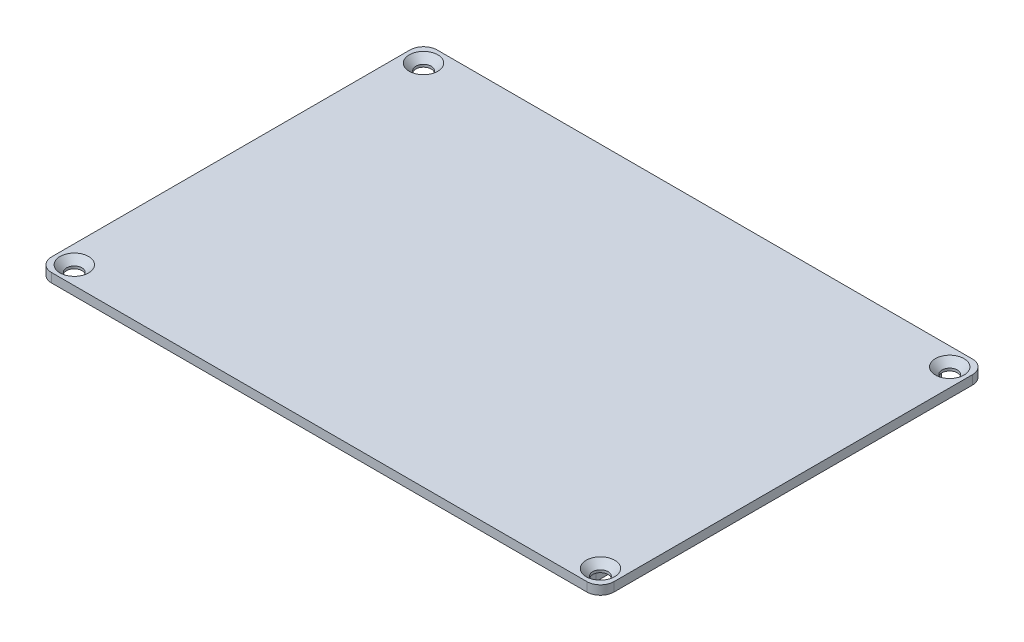
ISO-10303-21;
HEADER;
FILE_DESCRIPTION(('STEP AP214'),'2;1');
FILE_NAME('part.step','',(''),(''),'','','');
FILE_SCHEMA(('AUTOMOTIVE_DESIGN { 1 0 10303 214 1 1 1 1 }'));
ENDSEC;
DATA;
#1=APPLICATION_CONTEXT('core data for automotive mechanical design processes');
#2=APPLICATION_PROTOCOL_DEFINITION('international standard','automotive_design',2000,#1);
#3=PRODUCT_CONTEXT('',#1,'mechanical');
#4=PRODUCT('Part','Part','',(#3));
#5=PRODUCT_RELATED_PRODUCT_CATEGORY('part','',(#4));
#6=PRODUCT_DEFINITION_FORMATION('','',#4);
#7=PRODUCT_DEFINITION_CONTEXT('part definition',#1,'design');
#8=PRODUCT_DEFINITION('design','',#6,#7);
#9=PRODUCT_DEFINITION_SHAPE('','',#8);
#10=(LENGTH_UNIT() NAMED_UNIT(*) SI_UNIT(.MILLI.,.METRE.));
#11=(NAMED_UNIT(*) PLANE_ANGLE_UNIT() SI_UNIT($,.RADIAN.));
#12=(NAMED_UNIT(*) SI_UNIT($,.STERADIAN.) SOLID_ANGLE_UNIT());
#13=UNCERTAINTY_MEASURE_WITH_UNIT(LENGTH_MEASURE(1.E-05),#10,'distance_accuracy_value','');
#14=(GEOMETRIC_REPRESENTATION_CONTEXT(3) GLOBAL_UNCERTAINTY_ASSIGNED_CONTEXT((#13)) GLOBAL_UNIT_ASSIGNED_CONTEXT((#10,
#11,#12)) REPRESENTATION_CONTEXT('',''));
#15=CARTESIAN_POINT('',(0.,0.,0.));
#16=DIRECTION('',(0.,0.,1.));
#17=DIRECTION('',(1.,0.,0.));
#18=AXIS2_PLACEMENT_3D('',#15,#16,#17);
#19=CARTESIAN_POINT('',(0.,0.,0.));
#20=DIRECTION('',(0.,-1.,0.));
#21=DIRECTION('',(0.,0.,-1.));
#22=AXIS2_PLACEMENT_3D('',#19,#20,#21);
#23=PLANE('',#22);
#24=DIRECTION('',(0.,0.,-1.));
#25=VECTOR('',#24,1.);
#26=CARTESIAN_POINT('',(112.,0.,0.));
#27=LINE('',#26,#25);
#28=CARTESIAN_POINT('',(112.,0.,-3.));
#29=VERTEX_POINT('',#28);
#30=CARTESIAN_POINT('',(112.,0.,-78.));
#31=VERTEX_POINT('',#30);
#32=EDGE_CURVE('E222',#29,#31,#27,.T.);
#33=ORIENTED_EDGE('',*,*,#32,.F.);
#34=CARTESIAN_POINT('',(109.,0.,-3.));
#35=DIRECTION('',(0.,-1.,0.));
#36=DIRECTION('',(0.,0.,-1.));
#37=AXIS2_PLACEMENT_3D('',#34,#35,#36);
#38=CIRCLE('',#37,3.);
#39=CARTESIAN_POINT('',(109.,0.,0.));
#40=VERTEX_POINT('',#39);
#41=EDGE_CURVE('E237',#29,#40,#38,.T.);
#42=ORIENTED_EDGE('',*,*,#41,.T.);
#43=DIRECTION('',(1.,0.,0.));
#44=VECTOR('',#43,1.);
#45=CARTESIAN_POINT('',(0.,0.,0.));
#46=LINE('',#45,#44);
#47=CARTESIAN_POINT('',(3.,0.,0.));
#48=VERTEX_POINT('',#47);
#49=EDGE_CURVE('E200',#48,#40,#46,.T.);
#50=ORIENTED_EDGE('',*,*,#49,.F.);
#51=CARTESIAN_POINT('',(3.,0.,-3.));
#52=DIRECTION('',(0.,-1.,0.));
#53=DIRECTION('',(0.,0.,-1.));
#54=AXIS2_PLACEMENT_3D('',#51,#52,#53);
#55=CIRCLE('',#54,3.);
#56=CARTESIAN_POINT('',(0.,0.,-3.));
#57=VERTEX_POINT('',#56);
#58=EDGE_CURVE('E235',#48,#57,#55,.T.);
#59=ORIENTED_EDGE('',*,*,#58,.T.);
#60=DIRECTION('',(0.,0.,1.));
#61=VECTOR('',#60,1.);
#62=CARTESIAN_POINT('',(0.,0.,0.));
#63=LINE('',#62,#61);
#64=CARTESIAN_POINT('',(0.,0.,-78.));
#65=VERTEX_POINT('',#64);
#66=EDGE_CURVE('E196',#65,#57,#63,.T.);
#67=ORIENTED_EDGE('',*,*,#66,.F.);
#68=CARTESIAN_POINT('',(3.,0.,-78.));
#69=DIRECTION('',(0.,-1.,0.));
#70=DIRECTION('',(0.,0.,-1.));
#71=AXIS2_PLACEMENT_3D('',#68,#69,#70);
#72=CIRCLE('',#71,3.);
#73=CARTESIAN_POINT('',(3.,0.,-81.));
#74=VERTEX_POINT('',#73);
#75=EDGE_CURVE('E233',#65,#74,#72,.T.);
#76=ORIENTED_EDGE('',*,*,#75,.T.);
#77=DIRECTION('',(-1.,0.,0.));
#78=VECTOR('',#77,1.);
#79=CARTESIAN_POINT('',(0.,0.,-81.));
#80=LINE('',#79,#78);
#81=CARTESIAN_POINT('',(109.,0.,-81.));
#82=VERTEX_POINT('',#81);
#83=EDGE_CURVE('E210',#82,#74,#80,.T.);
#84=ORIENTED_EDGE('',*,*,#83,.F.);
#85=CARTESIAN_POINT('',(109.,0.,-78.));
#86=DIRECTION('',(0.,-1.,0.));
#87=DIRECTION('',(0.,0.,-1.));
#88=AXIS2_PLACEMENT_3D('',#85,#86,#87);
#89=CIRCLE('',#88,3.);
#90=EDGE_CURVE('E231',#82,#31,#89,.T.);
#91=ORIENTED_EDGE('',*,*,#90,.T.);
#92=EDGE_LOOP('',(#33,#42,#50,#59,#67,#76,#84,#91));
#93=FACE_BOUND('',#92,.T.);
#94=DIRECTION('',(-1.,0.,0.));
#95=VECTOR('',#94,1.);
#96=CARTESIAN_POINT('',(2.,0.,-79.));
#97=LINE('',#96,#95);
#98=CARTESIAN_POINT('',(110.,0.,-79.));
#99=VERTEX_POINT('',#98);
#100=CARTESIAN_POINT('',(2.,0.,-79.));
#101=VERTEX_POINT('',#100);
#102=EDGE_CURVE('E191',#99,#101,#97,.T.);
#103=ORIENTED_EDGE('',*,*,#102,.T.);
#104=DIRECTION('',(0.,0.,1.));
#105=VECTOR('',#104,1.);
#106=CARTESIAN_POINT('',(2.,0.,-2.));
#107=LINE('',#106,#105);
#108=CARTESIAN_POINT('',(2.,0.,-2.));
#109=VERTEX_POINT('',#108);
#110=EDGE_CURVE('E336',#101,#109,#107,.T.);
#111=ORIENTED_EDGE('',*,*,#110,.T.);
#112=DIRECTION('',(1.,0.,0.));
#113=VECTOR('',#112,1.);
#114=CARTESIAN_POINT('',(2.,0.,-2.));
#115=LINE('',#114,#113);
#116=CARTESIAN_POINT('',(110.,0.,-2.));
#117=VERTEX_POINT('',#116);
#118=EDGE_CURVE('E195',#109,#117,#115,.T.);
#119=ORIENTED_EDGE('',*,*,#118,.T.);
#120=DIRECTION('',(0.,0.,-1.));
#121=VECTOR('',#120,1.);
#122=CARTESIAN_POINT('',(110.,0.,-2.));
#123=LINE('',#122,#121);
#124=EDGE_CURVE('E351',#117,#99,#123,.T.);
#125=ORIENTED_EDGE('',*,*,#124,.T.);
#126=EDGE_LOOP('',(#103,#111,#119,#125));
#127=FACE_BOUND('',#126,.T.);
#128=ADVANCED_FACE('F33',(#93,#127),#23,.T.);
#129=CARTESIAN_POINT('',(0.,2.,0.));
#130=DIRECTION('',(1.,0.,0.));
#131=DIRECTION('',(0.,0.,-1.));
#132=AXIS2_PLACEMENT_3D('',#129,#130,#131);
#133=PLANE('',#132);
#134=ORIENTED_EDGE('',*,*,#66,.T.);
#135=DIRECTION('',(0.,-1.,0.));
#136=VECTOR('',#135,1.);
#137=CARTESIAN_POINT('',(0.,2.,-3.));
#138=LINE('',#137,#136);
#139=CARTESIAN_POINT('',(0.,2.,-3.));
#140=VERTEX_POINT('',#139);
#141=EDGE_CURVE('E281',#57,#140,#138,.F.);
#142=ORIENTED_EDGE('',*,*,#141,.T.);
#143=DIRECTION('',(0.,0.,1.));
#144=VECTOR('',#143,1.);
#145=CARTESIAN_POINT('',(0.,2.,0.));
#146=LINE('',#145,#144);
#147=CARTESIAN_POINT('',(0.,2.,-78.));
#148=VERTEX_POINT('',#147);
#149=EDGE_CURVE('E206',#148,#140,#146,.T.);
#150=ORIENTED_EDGE('',*,*,#149,.F.);
#151=DIRECTION('',(0.,-1.,0.));
#152=VECTOR('',#151,1.);
#153=CARTESIAN_POINT('',(0.,2.,-78.));
#154=LINE('',#153,#152);
#155=EDGE_CURVE('E278',#148,#65,#154,.T.);
#156=ORIENTED_EDGE('',*,*,#155,.T.);
#157=EDGE_LOOP('',(#134,#142,#150,#156));
#158=FACE_BOUND('',#157,.T.);
#159=ADVANCED_FACE('F365',(#158),#133,.F.);
#160=CARTESIAN_POINT('',(0.,2.,0.));
#161=DIRECTION('',(0.,0.,-1.));
#162=DIRECTION('',(-1.,0.,0.));
#163=AXIS2_PLACEMENT_3D('',#160,#161,#162);
#164=PLANE('',#163);
#165=ORIENTED_EDGE('',*,*,#49,.T.);
#166=DIRECTION('',(0.,-1.,0.));
#167=VECTOR('',#166,1.);
#168=CARTESIAN_POINT('',(109.,2.,0.));
#169=LINE('',#168,#167);
#170=CARTESIAN_POINT('',(109.,2.,0.));
#171=VERTEX_POINT('',#170);
#172=EDGE_CURVE('E242',#40,#171,#169,.F.);
#173=ORIENTED_EDGE('',*,*,#172,.T.);
#174=DIRECTION('',(1.,0.,0.));
#175=VECTOR('',#174,1.);
#176=CARTESIAN_POINT('',(0.,2.,0.));
#177=LINE('',#176,#175);
#178=CARTESIAN_POINT('',(3.,2.,0.));
#179=VERTEX_POINT('',#178);
#180=EDGE_CURVE('E209',#179,#171,#177,.T.);
#181=ORIENTED_EDGE('',*,*,#180,.F.);
#182=DIRECTION('',(0.,-1.,0.));
#183=VECTOR('',#182,1.);
#184=CARTESIAN_POINT('',(3.,2.,0.));
#185=LINE('',#184,#183);
#186=EDGE_CURVE('E239',#179,#48,#185,.T.);
#187=ORIENTED_EDGE('',*,*,#186,.T.);
#188=EDGE_LOOP('',(#165,#173,#181,#187));
#189=FACE_BOUND('',#188,.T.);
#190=ADVANCED_FACE('F371',(#189),#164,.F.);
#191=CARTESIAN_POINT('',(112.,2.,0.));
#192=DIRECTION('',(-1.,0.,0.));
#193=DIRECTION('',(0.,0.,1.));
#194=AXIS2_PLACEMENT_3D('',#191,#192,#193);
#195=PLANE('',#194);
#196=DIRECTION('',(0.,0.,-1.));
#197=VECTOR('',#196,1.);
#198=CARTESIAN_POINT('',(112.,2.,0.));
#199=LINE('',#198,#197);
#200=CARTESIAN_POINT('',(112.,2.,-3.));
#201=VERTEX_POINT('',#200);
#202=CARTESIAN_POINT('',(112.,2.,-78.));
#203=VERTEX_POINT('',#202);
#204=EDGE_CURVE('E213',#201,#203,#199,.T.);
#205=ORIENTED_EDGE('',*,*,#204,.F.);
#206=DIRECTION('',(0.,-1.,0.));
#207=VECTOR('',#206,1.);
#208=CARTESIAN_POINT('',(112.,2.,-3.));
#209=LINE('',#208,#207);
#210=EDGE_CURVE('E228',#201,#29,#209,.T.);
#211=ORIENTED_EDGE('',*,*,#210,.T.);
#212=ORIENTED_EDGE('',*,*,#32,.T.);
#213=DIRECTION('',(0.,-1.,0.));
#214=VECTOR('',#213,1.);
#215=CARTESIAN_POINT('',(112.,2.,-78.));
#216=LINE('',#215,#214);
#217=EDGE_CURVE('E218',#31,#203,#216,.F.);
#218=ORIENTED_EDGE('',*,*,#217,.T.);
#219=EDGE_LOOP('',(#205,#211,#212,#218));
#220=FACE_BOUND('',#219,.T.);
#221=ADVANCED_FACE('F381',(#220),#195,.F.);
#222=CARTESIAN_POINT('',(0.,2.,-81.));
#223=DIRECTION('',(0.,0.,1.));
#224=DIRECTION('',(1.,0.,0.));
#225=AXIS2_PLACEMENT_3D('',#222,#223,#224);
#226=PLANE('',#225);
#227=ORIENTED_EDGE('',*,*,#83,.T.);
#228=DIRECTION('',(0.,-1.,0.));
#229=VECTOR('',#228,1.);
#230=CARTESIAN_POINT('',(3.,2.,-81.));
#231=LINE('',#230,#229);
#232=CARTESIAN_POINT('',(3.,2.,-81.));
#233=VERTEX_POINT('',#232);
#234=EDGE_CURVE('E286',#74,#233,#231,.F.);
#235=ORIENTED_EDGE('',*,*,#234,.T.);
#236=DIRECTION('',(-1.,0.,0.));
#237=VECTOR('',#236,1.);
#238=CARTESIAN_POINT('',(0.,2.,-81.));
#239=LINE('',#238,#237);
#240=CARTESIAN_POINT('',(109.,2.,-81.));
#241=VERTEX_POINT('',#240);
#242=EDGE_CURVE('E216',#241,#233,#239,.T.);
#243=ORIENTED_EDGE('',*,*,#242,.F.);
#244=DIRECTION('',(0.,-1.,0.));
#245=VECTOR('',#244,1.);
#246=CARTESIAN_POINT('',(109.,2.,-81.));
#247=LINE('',#246,#245);
#248=EDGE_CURVE('E283',#241,#82,#247,.T.);
#249=ORIENTED_EDGE('',*,*,#248,.T.);
#250=EDGE_LOOP('',(#227,#235,#243,#249));
#251=FACE_BOUND('',#250,.T.);
#252=ADVANCED_FACE('F378',(#251),#226,.F.);
#253=CARTESIAN_POINT('',(2.,2.,-2.));
#254=DIRECTION('',(1.,0.,0.));
#255=DIRECTION('',(0.,0.,-1.));
#256=AXIS2_PLACEMENT_3D('',#253,#254,#255);
#257=PLANE('',#256);
#258=ORIENTED_EDGE('',*,*,#110,.F.);
#259=DIRECTION('',(0.,-1.,0.));
#260=VECTOR('',#259,1.);
#261=CARTESIAN_POINT('',(2.,2.,-79.));
#262=LINE('',#261,#260);
#263=CARTESIAN_POINT('',(2.,2.,-79.));
#264=VERTEX_POINT('',#263);
#265=EDGE_CURVE('E190',#264,#101,#262,.T.);
#266=ORIENTED_EDGE('',*,*,#265,.F.);
#267=DIRECTION('',(0.,0.,1.));
#268=VECTOR('',#267,1.);
#269=CARTESIAN_POINT('',(2.,2.,-2.));
#270=LINE('',#269,#268);
#271=CARTESIAN_POINT('',(2.,2.,-2.));
#272=VERTEX_POINT('',#271);
#273=EDGE_CURVE('E175',#264,#272,#270,.T.);
#274=ORIENTED_EDGE('',*,*,#273,.T.);
#275=DIRECTION('',(0.,-1.,0.));
#276=VECTOR('',#275,1.);
#277=CARTESIAN_POINT('',(2.,2.,-2.));
#278=LINE('',#277,#276);
#279=EDGE_CURVE('E187',#272,#109,#278,.T.);
#280=ORIENTED_EDGE('',*,*,#279,.T.);
#281=EDGE_LOOP('',(#258,#266,#274,#280));
#282=FACE_BOUND('',#281,.T.);
#283=ADVANCED_FACE('F186',(#282),#257,.T.);
#284=CARTESIAN_POINT('',(2.,2.,-2.));
#285=DIRECTION('',(0.,0.,-1.));
#286=DIRECTION('',(-1.,0.,0.));
#287=AXIS2_PLACEMENT_3D('',#284,#285,#286);
#288=PLANE('',#287);
#289=ORIENTED_EDGE('',*,*,#118,.F.);
#290=ORIENTED_EDGE('',*,*,#279,.F.);
#291=DIRECTION('',(1.,0.,0.));
#292=VECTOR('',#291,1.);
#293=CARTESIAN_POINT('',(2.,2.,-2.));
#294=LINE('',#293,#292);
#295=CARTESIAN_POINT('',(110.,2.,-2.));
#296=VERTEX_POINT('',#295);
#297=EDGE_CURVE('E172',#272,#296,#294,.T.);
#298=ORIENTED_EDGE('',*,*,#297,.T.);
#299=DIRECTION('',(0.,-1.,0.));
#300=VECTOR('',#299,1.);
#301=CARTESIAN_POINT('',(110.,2.,-2.));
#302=LINE('',#301,#300);
#303=EDGE_CURVE('E197',#296,#117,#302,.T.);
#304=ORIENTED_EDGE('',*,*,#303,.T.);
#305=EDGE_LOOP('',(#289,#290,#298,#304));
#306=FACE_BOUND('',#305,.T.);
#307=ADVANCED_FACE('F193',(#306),#288,.T.);
#308=CARTESIAN_POINT('',(110.,2.,-2.));
#309=DIRECTION('',(-1.,0.,0.));
#310=DIRECTION('',(0.,0.,1.));
#311=AXIS2_PLACEMENT_3D('',#308,#309,#310);
#312=PLANE('',#311);
#313=ORIENTED_EDGE('',*,*,#124,.F.);
#314=ORIENTED_EDGE('',*,*,#303,.F.);
#315=DIRECTION('',(0.,0.,-1.));
#316=VECTOR('',#315,1.);
#317=CARTESIAN_POINT('',(110.,2.,-2.));
#318=LINE('',#317,#316);
#319=CARTESIAN_POINT('',(110.,2.,-79.));
#320=VERTEX_POINT('',#319);
#321=EDGE_CURVE('E178',#296,#320,#318,.T.);
#322=ORIENTED_EDGE('',*,*,#321,.T.);
#323=DIRECTION('',(0.,-1.,0.));
#324=VECTOR('',#323,1.);
#325=CARTESIAN_POINT('',(110.,2.,-79.));
#326=LINE('',#325,#324);
#327=EDGE_CURVE('E202',#320,#99,#326,.T.);
#328=ORIENTED_EDGE('',*,*,#327,.T.);
#329=EDGE_LOOP('',(#313,#314,#322,#328));
#330=FACE_BOUND('',#329,.T.);
#331=ADVANCED_FACE('F360',(#330),#312,.T.);
#332=CARTESIAN_POINT('',(2.,2.,-79.));
#333=DIRECTION('',(0.,0.,1.));
#334=DIRECTION('',(1.,0.,0.));
#335=AXIS2_PLACEMENT_3D('',#332,#333,#334);
#336=PLANE('',#335);
#337=ORIENTED_EDGE('',*,*,#102,.F.);
#338=ORIENTED_EDGE('',*,*,#327,.F.);
#339=DIRECTION('',(-1.,0.,0.));
#340=VECTOR('',#339,1.);
#341=CARTESIAN_POINT('',(2.,2.,-79.));
#342=LINE('',#341,#340);
#343=EDGE_CURVE('E347',#320,#264,#342,.T.);
#344=ORIENTED_EDGE('',*,*,#343,.T.);
#345=ORIENTED_EDGE('',*,*,#265,.T.);
#346=EDGE_LOOP('',(#337,#338,#344,#345));
#347=FACE_BOUND('',#346,.T.);
#348=ADVANCED_FACE('F362',(#347),#336,.T.);
#349=CARTESIAN_POINT('',(0.,2.,0.));
#350=DIRECTION('',(0.,-1.,0.));
#351=DIRECTION('',(0.,0.,-1.));
#352=AXIS2_PLACEMENT_3D('',#349,#350,#351);
#353=PLANE('',#352);
#354=ORIENTED_EDGE('',*,*,#273,.F.);
#355=ORIENTED_EDGE('',*,*,#343,.F.);
#356=ORIENTED_EDGE('',*,*,#321,.F.);
#357=ORIENTED_EDGE('',*,*,#297,.F.);
#358=EDGE_LOOP('',(#354,#355,#356,#357));
#359=FACE_BOUND('',#358,.T.);
#360=ADVANCED_FACE('F174',(#359),#353,.T.);
#361=CARTESIAN_POINT('',(-6.,4.,2.));
#362=DIRECTION('',(1.,0.,0.));
#363=DIRECTION('',(0.,0.,-1.));
#364=AXIS2_PLACEMENT_3D('',#361,#362,#363);
#365=PLANE('',#364);
#366=DIRECTION('',(0.,0.,1.));
#367=VECTOR('',#366,1.);
#368=CARTESIAN_POINT('',(-6.,4.,2.));
#369=LINE('',#368,#367);
#370=CARTESIAN_POINT('',(-6.,4.,-80.));
#371=VERTEX_POINT('',#370);
#372=CARTESIAN_POINT('',(-6.,4.,-1.));
#373=VERTEX_POINT('',#372);
#374=EDGE_CURVE('E325',#371,#373,#369,.T.);
#375=ORIENTED_EDGE('',*,*,#374,.F.);
#376=DIRECTION('',(0.,-1.,0.));
#377=VECTOR('',#376,1.);
#378=CARTESIAN_POINT('',(-6.,4.,-80.));
#379=LINE('',#378,#377);
#380=CARTESIAN_POINT('',(-6.,2.,-80.));
#381=VERTEX_POINT('',#380);
#382=EDGE_CURVE('E275',#371,#381,#379,.T.);
#383=ORIENTED_EDGE('',*,*,#382,.T.);
#384=DIRECTION('',(0.,0.,1.));
#385=VECTOR('',#384,1.);
#386=CARTESIAN_POINT('',(-6.,2.,2.));
#387=LINE('',#386,#385);
#388=CARTESIAN_POINT('',(-6.,2.,-1.));
#389=VERTEX_POINT('',#388);
#390=EDGE_CURVE('E296',#381,#389,#387,.T.);
#391=ORIENTED_EDGE('',*,*,#390,.T.);
#392=DIRECTION('',(0.,-1.,0.));
#393=VECTOR('',#392,1.);
#394=CARTESIAN_POINT('',(-6.,4.,-1.));
#395=LINE('',#394,#393);
#396=EDGE_CURVE('E273',#389,#373,#395,.F.);
#397=ORIENTED_EDGE('',*,*,#396,.T.);
#398=EDGE_LOOP('',(#375,#383,#391,#397));
#399=FACE_BOUND('',#398,.T.);
#400=ADVANCED_FACE('F461',(#399),#365,.F.);
#401=CARTESIAN_POINT('',(-6.,4.,2.));
#402=DIRECTION('',(0.,0.,-1.));
#403=DIRECTION('',(-1.,0.,0.));
#404=AXIS2_PLACEMENT_3D('',#401,#402,#403);
#405=PLANE('',#404);
#406=DIRECTION('',(1.,0.,0.));
#407=VECTOR('',#406,1.);
#408=CARTESIAN_POINT('',(-6.,2.,2.));
#409=LINE('',#408,#407);
#410=CARTESIAN_POINT('',(-3.,2.,2.));
#411=VERTEX_POINT('',#410);
#412=CARTESIAN_POINT('',(115.,2.,2.));
#413=VERTEX_POINT('',#412);
#414=EDGE_CURVE('E339',#411,#413,#409,.T.);
#415=ORIENTED_EDGE('',*,*,#414,.T.);
#416=DIRECTION('',(0.,-1.,0.));
#417=VECTOR('',#416,1.);
#418=CARTESIAN_POINT('',(115.,4.,2.));
#419=LINE('',#418,#417);
#420=CARTESIAN_POINT('',(115.,4.,2.));
#421=VERTEX_POINT('',#420);
#422=EDGE_CURVE('E260',#413,#421,#419,.F.);
#423=ORIENTED_EDGE('',*,*,#422,.T.);
#424=DIRECTION('',(1.,0.,0.));
#425=VECTOR('',#424,1.);
#426=CARTESIAN_POINT('',(-6.,4.,2.));
#427=LINE('',#426,#425);
#428=CARTESIAN_POINT('',(-3.,4.,2.));
#429=VERTEX_POINT('',#428);
#430=EDGE_CURVE('E328',#429,#421,#427,.T.);
#431=ORIENTED_EDGE('',*,*,#430,.F.);
#432=DIRECTION('',(0.,-1.,0.));
#433=VECTOR('',#432,1.);
#434=CARTESIAN_POINT('',(-3.,4.,2.));
#435=LINE('',#434,#433);
#436=EDGE_CURVE('E257',#429,#411,#435,.T.);
#437=ORIENTED_EDGE('',*,*,#436,.T.);
#438=EDGE_LOOP('',(#415,#423,#431,#437));
#439=FACE_BOUND('',#438,.T.);
#440=ADVANCED_FACE('F467',(#439),#405,.F.);
#441=CARTESIAN_POINT('',(118.,4.,2.));
#442=DIRECTION('',(-1.,0.,0.));
#443=DIRECTION('',(0.,0.,1.));
#444=AXIS2_PLACEMENT_3D('',#441,#442,#443);
#445=PLANE('',#444);
#446=DIRECTION('',(0.,0.,-1.));
#447=VECTOR('',#446,1.);
#448=CARTESIAN_POINT('',(118.,4.,2.));
#449=LINE('',#448,#447);
#450=CARTESIAN_POINT('',(118.,4.,-1.));
#451=VERTEX_POINT('',#450);
#452=CARTESIAN_POINT('',(118.,4.,-80.));
#453=VERTEX_POINT('',#452);
#454=EDGE_CURVE('E332',#451,#453,#449,.T.);
#455=ORIENTED_EDGE('',*,*,#454,.F.);
#456=DIRECTION('',(0.,-1.,0.));
#457=VECTOR('',#456,1.);
#458=CARTESIAN_POINT('',(118.,4.,-1.));
#459=LINE('',#458,#457);
#460=CARTESIAN_POINT('',(118.,2.,-1.));
#461=VERTEX_POINT('',#460);
#462=EDGE_CURVE('E246',#451,#461,#459,.T.);
#463=ORIENTED_EDGE('',*,*,#462,.T.);
#464=DIRECTION('',(0.,0.,-1.));
#465=VECTOR('',#464,1.);
#466=CARTESIAN_POINT('',(118.,2.,2.));
#467=LINE('',#466,#465);
#468=CARTESIAN_POINT('',(118.,2.,-80.));
#469=VERTEX_POINT('',#468);
#470=EDGE_CURVE('E342',#461,#469,#467,.T.);
#471=ORIENTED_EDGE('',*,*,#470,.T.);
#472=DIRECTION('',(0.,-1.,0.));
#473=VECTOR('',#472,1.);
#474=CARTESIAN_POINT('',(118.,4.,-80.));
#475=LINE('',#474,#473);
#476=EDGE_CURVE('E244',#469,#453,#475,.F.);
#477=ORIENTED_EDGE('',*,*,#476,.T.);
#478=EDGE_LOOP('',(#455,#463,#471,#477));
#479=FACE_BOUND('',#478,.T.);
#480=ADVANCED_FACE('F452',(#479),#445,.F.);
#481=CARTESIAN_POINT('',(-6.,4.,-83.));
#482=DIRECTION('',(0.,0.,1.));
#483=DIRECTION('',(1.,0.,0.));
#484=AXIS2_PLACEMENT_3D('',#481,#482,#483);
#485=PLANE('',#484);
#486=DIRECTION('',(-1.,0.,0.));
#487=VECTOR('',#486,1.);
#488=CARTESIAN_POINT('',(-6.,4.,-83.));
#489=LINE('',#488,#487);
#490=CARTESIAN_POINT('',(115.,4.,-83.));
#491=VERTEX_POINT('',#490);
#492=CARTESIAN_POINT('',(-3.,4.,-83.));
#493=VERTEX_POINT('',#492);
#494=EDGE_CURVE('E334',#491,#493,#489,.T.);
#495=ORIENTED_EDGE('',*,*,#494,.F.);
#496=DIRECTION('',(0.,-1.,0.));
#497=VECTOR('',#496,1.);
#498=CARTESIAN_POINT('',(115.,4.,-83.));
#499=LINE('',#498,#497);
#500=CARTESIAN_POINT('',(115.,2.,-83.));
#501=VERTEX_POINT('',#500);
#502=EDGE_CURVE('E270',#491,#501,#499,.T.);
#503=ORIENTED_EDGE('',*,*,#502,.T.);
#504=DIRECTION('',(-1.,0.,0.));
#505=VECTOR('',#504,1.);
#506=CARTESIAN_POINT('',(-6.,2.,-83.));
#507=LINE('',#506,#505);
#508=CARTESIAN_POINT('',(-3.,2.,-83.));
#509=VERTEX_POINT('',#508);
#510=EDGE_CURVE('E329',#501,#509,#507,.T.);
#511=ORIENTED_EDGE('',*,*,#510,.T.);
#512=DIRECTION('',(0.,-1.,0.));
#513=VECTOR('',#512,1.);
#514=CARTESIAN_POINT('',(-3.,4.,-83.));
#515=LINE('',#514,#513);
#516=EDGE_CURVE('E50',#509,#493,#515,.F.);
#517=ORIENTED_EDGE('',*,*,#516,.T.);
#518=EDGE_LOOP('',(#495,#503,#511,#517));
#519=FACE_BOUND('',#518,.T.);
#520=ADVANCED_FACE('F455',(#519),#485,.F.);
#521=CARTESIAN_POINT('',(0.,4.,0.));
#522=DIRECTION('',(0.,-1.,0.));
#523=DIRECTION('',(0.,0.,-1.));
#524=AXIS2_PLACEMENT_3D('',#521,#522,#523);
#525=PLANE('',#524);
#526=CARTESIAN_POINT('',(-2.,4.,-2.));
#527=DIRECTION('',(0.,1.,0.));
#528=DIRECTION('',(0.,0.,1.));
#529=AXIS2_PLACEMENT_3D('',#526,#527,#528);
#530=CIRCLE('',#529,3.15);
#531=CARTESIAN_POINT('',(-2.,4.,1.15));
#532=VERTEX_POINT('',#531);
#533=EDGE_CURVE('E712',#532,#532,#530,.T.);
#534=ORIENTED_EDGE('',*,*,#533,.F.);
#535=EDGE_LOOP('',(#534));
#536=FACE_BOUND('',#535,.T.);
#537=CARTESIAN_POINT('',(114.,4.,-79.));
#538=DIRECTION('',(0.,1.,0.));
#539=DIRECTION('',(0.,0.,1.));
#540=AXIS2_PLACEMENT_3D('',#537,#538,#539);
#541=CIRCLE('',#540,3.15);
#542=CARTESIAN_POINT('',(114.,4.,-75.85));
#543=VERTEX_POINT('',#542);
#544=EDGE_CURVE('E311',#543,#543,#541,.T.);
#545=ORIENTED_EDGE('',*,*,#544,.F.);
#546=EDGE_LOOP('',(#545));
#547=FACE_BOUND('',#546,.T.);
#548=CARTESIAN_POINT('',(-2.,4.,-79.));
#549=DIRECTION('',(0.,1.,0.));
#550=DIRECTION('',(0.,0.,1.));
#551=AXIS2_PLACEMENT_3D('',#548,#549,#550);
#552=CIRCLE('',#551,3.15);
#553=CARTESIAN_POINT('',(-2.,4.,-75.85));
#554=VERTEX_POINT('',#553);
#555=EDGE_CURVE('E304',#554,#554,#552,.T.);
#556=ORIENTED_EDGE('',*,*,#555,.F.);
#557=EDGE_LOOP('',(#556));
#558=FACE_BOUND('',#557,.T.);
#559=CARTESIAN_POINT('',(114.,4.,-2.));
#560=DIRECTION('',(0.,1.,0.));
#561=DIRECTION('',(0.,0.,1.));
#562=AXIS2_PLACEMENT_3D('',#559,#560,#561);
#563=CIRCLE('',#562,3.15);
#564=CARTESIAN_POINT('',(114.,4.,1.15));
#565=VERTEX_POINT('',#564);
#566=EDGE_CURVE('E300',#565,#565,#563,.T.);
#567=ORIENTED_EDGE('',*,*,#566,.F.);
#568=EDGE_LOOP('',(#567));
#569=FACE_BOUND('',#568,.T.);
#570=ORIENTED_EDGE('',*,*,#430,.T.);
#571=CARTESIAN_POINT('',(115.,4.,-1.));
#572=DIRECTION('',(0.,-1.,0.));
#573=DIRECTION('',(0.,0.,-1.));
#574=AXIS2_PLACEMENT_3D('',#571,#572,#573);
#575=CIRCLE('',#574,3.);
#576=EDGE_CURVE('E267',#421,#451,#575,.F.);
#577=ORIENTED_EDGE('',*,*,#576,.T.);
#578=ORIENTED_EDGE('',*,*,#454,.T.);
#579=CARTESIAN_POINT('',(115.,4.,-80.));
#580=DIRECTION('',(0.,-1.,0.));
#581=DIRECTION('',(0.,0.,-1.));
#582=AXIS2_PLACEMENT_3D('',#579,#580,#581);
#583=CIRCLE('',#582,3.);
#584=EDGE_CURVE('E57',#453,#491,#583,.F.);
#585=ORIENTED_EDGE('',*,*,#584,.T.);
#586=ORIENTED_EDGE('',*,*,#494,.T.);
#587=CARTESIAN_POINT('',(-3.,4.,-80.));
#588=DIRECTION('',(0.,-1.,0.));
#589=DIRECTION('',(0.,0.,-1.));
#590=AXIS2_PLACEMENT_3D('',#587,#588,#589);
#591=CIRCLE('',#590,3.);
#592=EDGE_CURVE('E264',#493,#371,#591,.F.);
#593=ORIENTED_EDGE('',*,*,#592,.T.);
#594=ORIENTED_EDGE('',*,*,#374,.T.);
#595=CARTESIAN_POINT('',(-3.,4.,-1.));
#596=DIRECTION('',(0.,-1.,0.));
#597=DIRECTION('',(0.,0.,-1.));
#598=AXIS2_PLACEMENT_3D('',#595,#596,#597);
#599=CIRCLE('',#598,3.);
#600=EDGE_CURVE('E262',#373,#429,#599,.F.);
#601=ORIENTED_EDGE('',*,*,#600,.T.);
#602=EDGE_LOOP('',(#570,#577,#578,#585,#586,#593,#594,#601));
#603=FACE_BOUND('',#602,.T.);
#604=ADVANCED_FACE('F443',(#536,#547,#558,#569,#603),#525,.F.);
#605=CARTESIAN_POINT('',(-2.,2.,-2.));
#606=DIRECTION('',(0.,-1.,0.));
#607=DIRECTION('',(0.,0.,-1.));
#608=AXIS2_PLACEMENT_3D('',#605,#606,#607);
#609=CIRCLE('',#608,1.7);
#610=CARTESIAN_POINT('',(-2.,2.,-3.7));
#611=VERTEX_POINT('',#610);
#612=EDGE_CURVE('E37',#611,#611,#609,.T.);
#613=ORIENTED_EDGE('',*,*,#612,.F.);
#614=EDGE_LOOP('',(#613));
#615=FACE_BOUND('',#614,.T.);
#616=CARTESIAN_POINT('',(114.,2.,-79.));
#617=DIRECTION('',(0.,-1.,0.));
#618=DIRECTION('',(0.,0.,-1.));
#619=AXIS2_PLACEMENT_3D('',#616,#617,#618);
#620=CIRCLE('',#619,1.69999999999999);
#621=CARTESIAN_POINT('',(114.,2.,-80.7));
#622=VERTEX_POINT('',#621);
#623=EDGE_CURVE('E302',#622,#622,#620,.T.);
#624=ORIENTED_EDGE('',*,*,#623,.F.);
#625=EDGE_LOOP('',(#624));
#626=FACE_BOUND('',#625,.T.);
#627=CARTESIAN_POINT('',(-2.,2.,-79.));
#628=DIRECTION('',(0.,-1.,0.));
#629=DIRECTION('',(0.,0.,-1.));
#630=AXIS2_PLACEMENT_3D('',#627,#628,#629);
#631=CIRCLE('',#630,1.7);
#632=CARTESIAN_POINT('',(-2.,2.,-80.7));
#633=VERTEX_POINT('',#632);
#634=EDGE_CURVE('E298',#633,#633,#631,.T.);
#635=ORIENTED_EDGE('',*,*,#634,.F.);
#636=EDGE_LOOP('',(#635));
#637=FACE_BOUND('',#636,.T.);
#638=CARTESIAN_POINT('',(114.,2.,-2.));
#639=DIRECTION('',(0.,-1.,0.));
#640=DIRECTION('',(0.,0.,-1.));
#641=AXIS2_PLACEMENT_3D('',#638,#639,#640);
#642=CIRCLE('',#641,1.69999999999999);
#643=CARTESIAN_POINT('',(114.,2.,-3.69999999999999));
#644=VERTEX_POINT('',#643);
#645=EDGE_CURVE('E293',#644,#644,#642,.T.);
#646=ORIENTED_EDGE('',*,*,#645,.F.);
#647=EDGE_LOOP('',(#646));
#648=FACE_BOUND('',#647,.T.);
#649=ORIENTED_EDGE('',*,*,#204,.T.);
#650=CARTESIAN_POINT('',(109.,2.,-78.));
#651=DIRECTION('',(0.,-1.,0.));
#652=DIRECTION('',(0.,0.,-1.));
#653=AXIS2_PLACEMENT_3D('',#650,#651,#652);
#654=CIRCLE('',#653,3.);
#655=EDGE_CURVE('E11',#203,#241,#654,.F.);
#656=ORIENTED_EDGE('',*,*,#655,.T.);
#657=ORIENTED_EDGE('',*,*,#242,.T.);
#658=CARTESIAN_POINT('',(3.,2.,-78.));
#659=DIRECTION('',(0.,-1.,0.));
#660=DIRECTION('',(0.,0.,-1.));
#661=AXIS2_PLACEMENT_3D('',#658,#659,#660);
#662=CIRCLE('',#661,3.);
#663=EDGE_CURVE('E42',#233,#148,#662,.F.);
#664=ORIENTED_EDGE('',*,*,#663,.T.);
#665=ORIENTED_EDGE('',*,*,#149,.T.);
#666=CARTESIAN_POINT('',(3.,2.,-3.));
#667=DIRECTION('',(0.,-1.,0.));
#668=DIRECTION('',(0.,0.,-1.));
#669=AXIS2_PLACEMENT_3D('',#666,#667,#668);
#670=CIRCLE('',#669,3.);
#671=EDGE_CURVE('E290',#140,#179,#670,.F.);
#672=ORIENTED_EDGE('',*,*,#671,.T.);
#673=ORIENTED_EDGE('',*,*,#180,.T.);
#674=CARTESIAN_POINT('',(109.,2.,-3.));
#675=DIRECTION('',(0.,-1.,0.));
#676=DIRECTION('',(0.,0.,-1.));
#677=AXIS2_PLACEMENT_3D('',#674,#675,#676);
#678=CIRCLE('',#677,3.);
#679=EDGE_CURVE('E288',#171,#201,#678,.F.);
#680=ORIENTED_EDGE('',*,*,#679,.T.);
#681=EDGE_LOOP('',(#649,#656,#657,#664,#665,#672,#673,#680));
#682=FACE_BOUND('',#681,.T.);
#683=ORIENTED_EDGE('',*,*,#470,.F.);
#684=CARTESIAN_POINT('',(115.,2.,-1.));
#685=DIRECTION('',(0.,-1.,0.));
#686=DIRECTION('',(0.,0.,-1.));
#687=AXIS2_PLACEMENT_3D('',#684,#685,#686);
#688=CIRCLE('',#687,3.);
#689=EDGE_CURVE('E255',#461,#413,#688,.T.);
#690=ORIENTED_EDGE('',*,*,#689,.T.);
#691=ORIENTED_EDGE('',*,*,#414,.F.);
#692=CARTESIAN_POINT('',(-3.,2.,-1.));
#693=DIRECTION('',(0.,-1.,0.));
#694=DIRECTION('',(0.,0.,-1.));
#695=AXIS2_PLACEMENT_3D('',#692,#693,#694);
#696=CIRCLE('',#695,3.);
#697=EDGE_CURVE('E249',#411,#389,#696,.T.);
#698=ORIENTED_EDGE('',*,*,#697,.T.);
#699=ORIENTED_EDGE('',*,*,#390,.F.);
#700=CARTESIAN_POINT('',(-3.,2.,-80.));
#701=DIRECTION('',(0.,-1.,0.));
#702=DIRECTION('',(0.,0.,-1.));
#703=AXIS2_PLACEMENT_3D('',#700,#701,#702);
#704=CIRCLE('',#703,3.);
#705=EDGE_CURVE('E251',#381,#509,#704,.T.);
#706=ORIENTED_EDGE('',*,*,#705,.T.);
#707=ORIENTED_EDGE('',*,*,#510,.F.);
#708=CARTESIAN_POINT('',(115.,2.,-80.));
#709=DIRECTION('',(0.,-1.,0.));
#710=DIRECTION('',(0.,0.,-1.));
#711=AXIS2_PLACEMENT_3D('',#708,#709,#710);
#712=CIRCLE('',#711,3.);
#713=EDGE_CURVE('E253',#501,#469,#712,.T.);
#714=ORIENTED_EDGE('',*,*,#713,.T.);
#715=EDGE_LOOP('',(#683,#690,#691,#698,#699,#706,#707,#714));
#716=FACE_BOUND('',#715,.T.);
#717=ADVANCED_FACE('F393',(#615,#626,#637,#648,#682,#716),#353,.T.);
#718=CARTESIAN_POINT('',(109.,2.,-3.));
#719=DIRECTION('',(0.,-1.,0.));
#720=DIRECTION('',(0.,0.,-1.));
#721=AXIS2_PLACEMENT_3D('',#718,#719,#720);
#722=CYLINDRICAL_SURFACE('',#721,3.);
#723=ORIENTED_EDGE('',*,*,#679,.F.);
#724=ORIENTED_EDGE('',*,*,#172,.F.);
#725=ORIENTED_EDGE('',*,*,#41,.F.);
#726=ORIENTED_EDGE('',*,*,#210,.F.);
#727=EDGE_LOOP('',(#723,#724,#725,#726));
#728=FACE_BOUND('',#727,.T.);
#729=ADVANCED_FACE('F389',(#728),#722,.T.);
#730=CARTESIAN_POINT('',(115.,4.,-1.));
#731=DIRECTION('',(0.,-1.,0.));
#732=DIRECTION('',(0.,0.,-1.));
#733=AXIS2_PLACEMENT_3D('',#730,#731,#732);
#734=CYLINDRICAL_SURFACE('',#733,3.);
#735=ORIENTED_EDGE('',*,*,#576,.F.);
#736=ORIENTED_EDGE('',*,*,#422,.F.);
#737=ORIENTED_EDGE('',*,*,#689,.F.);
#738=ORIENTED_EDGE('',*,*,#462,.F.);
#739=EDGE_LOOP('',(#735,#736,#737,#738));
#740=FACE_BOUND('',#739,.T.);
#741=ADVANCED_FACE('F392',(#740),#734,.T.);
#742=CARTESIAN_POINT('',(115.,4.,-80.));
#743=DIRECTION('',(0.,-1.,0.));
#744=DIRECTION('',(0.,0.,-1.));
#745=AXIS2_PLACEMENT_3D('',#742,#743,#744);
#746=CYLINDRICAL_SURFACE('',#745,3.);
#747=ORIENTED_EDGE('',*,*,#584,.F.);
#748=ORIENTED_EDGE('',*,*,#476,.F.);
#749=ORIENTED_EDGE('',*,*,#713,.F.);
#750=ORIENTED_EDGE('',*,*,#502,.F.);
#751=EDGE_LOOP('',(#747,#748,#749,#750));
#752=FACE_BOUND('',#751,.T.);
#753=ADVANCED_FACE('F397',(#752),#746,.T.);
#754=CARTESIAN_POINT('',(-3.,4.,-80.));
#755=DIRECTION('',(0.,-1.,0.));
#756=DIRECTION('',(0.,0.,-1.));
#757=AXIS2_PLACEMENT_3D('',#754,#755,#756);
#758=CYLINDRICAL_SURFACE('',#757,3.);
#759=ORIENTED_EDGE('',*,*,#592,.F.);
#760=ORIENTED_EDGE('',*,*,#516,.F.);
#761=ORIENTED_EDGE('',*,*,#705,.F.);
#762=ORIENTED_EDGE('',*,*,#382,.F.);
#763=EDGE_LOOP('',(#759,#760,#761,#762));
#764=FACE_BOUND('',#763,.T.);
#765=ADVANCED_FACE('F401',(#764),#758,.T.);
#766=CARTESIAN_POINT('',(-3.,4.,-1.));
#767=DIRECTION('',(0.,-1.,0.));
#768=DIRECTION('',(0.,0.,-1.));
#769=AXIS2_PLACEMENT_3D('',#766,#767,#768);
#770=CYLINDRICAL_SURFACE('',#769,3.);
#771=ORIENTED_EDGE('',*,*,#600,.F.);
#772=ORIENTED_EDGE('',*,*,#396,.F.);
#773=ORIENTED_EDGE('',*,*,#697,.F.);
#774=ORIENTED_EDGE('',*,*,#436,.F.);
#775=EDGE_LOOP('',(#771,#772,#773,#774));
#776=FACE_BOUND('',#775,.T.);
#777=ADVANCED_FACE('F405',(#776),#770,.T.);
#778=CARTESIAN_POINT('',(3.,2.,-3.));
#779=DIRECTION('',(0.,-1.,0.));
#780=DIRECTION('',(0.,0.,-1.));
#781=AXIS2_PLACEMENT_3D('',#778,#779,#780);
#782=CYLINDRICAL_SURFACE('',#781,3.);
#783=ORIENTED_EDGE('',*,*,#671,.F.);
#784=ORIENTED_EDGE('',*,*,#141,.F.);
#785=ORIENTED_EDGE('',*,*,#58,.F.);
#786=ORIENTED_EDGE('',*,*,#186,.F.);
#787=EDGE_LOOP('',(#783,#784,#785,#786));
#788=FACE_BOUND('',#787,.T.);
#789=ADVANCED_FACE('F409',(#788),#782,.T.);
#790=CARTESIAN_POINT('',(3.,2.,-78.));
#791=DIRECTION('',(0.,-1.,0.));
#792=DIRECTION('',(0.,0.,-1.));
#793=AXIS2_PLACEMENT_3D('',#790,#791,#792);
#794=CYLINDRICAL_SURFACE('',#793,3.);
#795=ORIENTED_EDGE('',*,*,#663,.F.);
#796=ORIENTED_EDGE('',*,*,#234,.F.);
#797=ORIENTED_EDGE('',*,*,#75,.F.);
#798=ORIENTED_EDGE('',*,*,#155,.F.);
#799=EDGE_LOOP('',(#795,#796,#797,#798));
#800=FACE_BOUND('',#799,.T.);
#801=ADVANCED_FACE('F412',(#800),#794,.T.);
#802=CARTESIAN_POINT('',(109.,2.,-78.));
#803=DIRECTION('',(0.,-1.,0.));
#804=DIRECTION('',(0.,0.,-1.));
#805=AXIS2_PLACEMENT_3D('',#802,#803,#804);
#806=CYLINDRICAL_SURFACE('',#805,3.);
#807=ORIENTED_EDGE('',*,*,#655,.F.);
#808=ORIENTED_EDGE('',*,*,#217,.F.);
#809=ORIENTED_EDGE('',*,*,#90,.F.);
#810=ORIENTED_EDGE('',*,*,#248,.F.);
#811=EDGE_LOOP('',(#807,#808,#809,#810));
#812=FACE_BOUND('',#811,.T.);
#813=ADVANCED_FACE('F35',(#812),#806,.T.);
#814=CARTESIAN_POINT('',(114.,4.,-2.));
#815=DIRECTION('',(0.,1.,0.));
#816=DIRECTION('',(0.,0.,1.));
#817=AXIS2_PLACEMENT_3D('',#814,#815,#816);
#818=CYLINDRICAL_SURFACE('',#817,1.69999999999999);
#819=ORIENTED_EDGE('',*,*,#645,.T.);
#820=EDGE_LOOP('',(#819));
#821=FACE_BOUND('',#820,.T.);
#822=CARTESIAN_POINT('',(114.,2.55,-2.));
#823=DIRECTION('',(0.,1.,0.));
#824=DIRECTION('',(0.,0.,1.));
#825=AXIS2_PLACEMENT_3D('',#822,#823,#824);
#826=CIRCLE('',#825,1.69999999999999);
#827=CARTESIAN_POINT('',(114.,2.55,-0.300000000000007));
#828=VERTEX_POINT('',#827);
#829=EDGE_CURVE('E297',#828,#828,#826,.T.);
#830=ORIENTED_EDGE('',*,*,#829,.T.);
#831=EDGE_LOOP('',(#830));
#832=FACE_BOUND('',#831,.T.);
#833=ADVANCED_FACE('F419',(#821,#832),#818,.F.);
#834=CARTESIAN_POINT('',(114.,4.,-2.));
#835=DIRECTION('',(0.,1.,0.));
#836=DIRECTION('',(0.,0.,1.));
#837=AXIS2_PLACEMENT_3D('',#834,#835,#836);
#838=CONICAL_SURFACE('',#837,3.15,0.78539816339745);
#839=ORIENTED_EDGE('',*,*,#829,.F.);
#840=EDGE_LOOP('',(#839));
#841=FACE_BOUND('',#840,.T.);
#842=ORIENTED_EDGE('',*,*,#566,.T.);
#843=EDGE_LOOP('',(#842));
#844=FACE_BOUND('',#843,.T.);
#845=ADVANCED_FACE('F633',(#841,#844),#838,.F.);
#846=CARTESIAN_POINT('',(-2.,4.,-79.));
#847=DIRECTION('',(0.,1.,0.));
#848=DIRECTION('',(0.,0.,1.));
#849=AXIS2_PLACEMENT_3D('',#846,#847,#848);
#850=CYLINDRICAL_SURFACE('',#849,1.7);
#851=ORIENTED_EDGE('',*,*,#634,.T.);
#852=EDGE_LOOP('',(#851));
#853=FACE_BOUND('',#852,.T.);
#854=CARTESIAN_POINT('',(-2.,2.55,-79.));
#855=DIRECTION('',(0.,1.,0.));
#856=DIRECTION('',(0.,0.,1.));
#857=AXIS2_PLACEMENT_3D('',#854,#855,#856);
#858=CIRCLE('',#857,1.7);
#859=CARTESIAN_POINT('',(-2.,2.55,-77.3));
#860=VERTEX_POINT('',#859);
#861=EDGE_CURVE('E301',#860,#860,#858,.T.);
#862=ORIENTED_EDGE('',*,*,#861,.T.);
#863=EDGE_LOOP('',(#862));
#864=FACE_BOUND('',#863,.T.);
#865=ADVANCED_FACE('F643',(#853,#864),#850,.F.);
#866=CARTESIAN_POINT('',(-2.,4.,-79.));
#867=DIRECTION('',(0.,1.,0.));
#868=DIRECTION('',(0.,0.,1.));
#869=AXIS2_PLACEMENT_3D('',#866,#867,#868);
#870=CONICAL_SURFACE('',#869,3.15,0.785398163397449);
#871=ORIENTED_EDGE('',*,*,#861,.F.);
#872=EDGE_LOOP('',(#871));
#873=FACE_BOUND('',#872,.T.);
#874=ORIENTED_EDGE('',*,*,#555,.T.);
#875=EDGE_LOOP('',(#874));
#876=FACE_BOUND('',#875,.T.);
#877=ADVANCED_FACE('F653',(#873,#876),#870,.F.);
#878=CARTESIAN_POINT('',(114.,4.,-79.));
#879=DIRECTION('',(0.,1.,0.));
#880=DIRECTION('',(0.,0.,1.));
#881=AXIS2_PLACEMENT_3D('',#878,#879,#880);
#882=CYLINDRICAL_SURFACE('',#881,1.69999999999999);
#883=ORIENTED_EDGE('',*,*,#623,.T.);
#884=EDGE_LOOP('',(#883));
#885=FACE_BOUND('',#884,.T.);
#886=CARTESIAN_POINT('',(114.,2.55,-79.));
#887=DIRECTION('',(0.,1.,0.));
#888=DIRECTION('',(0.,0.,1.));
#889=AXIS2_PLACEMENT_3D('',#886,#887,#888);
#890=CIRCLE('',#889,1.69999999999999);
#891=CARTESIAN_POINT('',(114.,2.55,-77.3));
#892=VERTEX_POINT('',#891);
#893=EDGE_CURVE('E305',#892,#892,#890,.T.);
#894=ORIENTED_EDGE('',*,*,#893,.T.);
#895=EDGE_LOOP('',(#894));
#896=FACE_BOUND('',#895,.T.);
#897=ADVANCED_FACE('F663',(#885,#896),#882,.F.);
#898=CARTESIAN_POINT('',(114.,4.,-79.));
#899=DIRECTION('',(0.,1.,0.));
#900=DIRECTION('',(0.,0.,1.));
#901=AXIS2_PLACEMENT_3D('',#898,#899,#900);
#902=CONICAL_SURFACE('',#901,3.15,0.78539816339745);
#903=ORIENTED_EDGE('',*,*,#893,.F.);
#904=EDGE_LOOP('',(#903));
#905=FACE_BOUND('',#904,.T.);
#906=ORIENTED_EDGE('',*,*,#544,.T.);
#907=EDGE_LOOP('',(#906));
#908=FACE_BOUND('',#907,.T.);
#909=ADVANCED_FACE('F673',(#905,#908),#902,.F.);
#910=CARTESIAN_POINT('',(-2.,4.,-2.));
#911=DIRECTION('',(0.,1.,0.));
#912=DIRECTION('',(0.,0.,1.));
#913=AXIS2_PLACEMENT_3D('',#910,#911,#912);
#914=CYLINDRICAL_SURFACE('',#913,1.7);
#915=ORIENTED_EDGE('',*,*,#612,.T.);
#916=EDGE_LOOP('',(#915));
#917=FACE_BOUND('',#916,.T.);
#918=CARTESIAN_POINT('',(-2.,2.55,-2.));
#919=DIRECTION('',(0.,1.,0.));
#920=DIRECTION('',(0.,0.,1.));
#921=AXIS2_PLACEMENT_3D('',#918,#919,#920);
#922=CIRCLE('',#921,1.7);
#923=CARTESIAN_POINT('',(-2.,2.55,-0.300000000000001));
#924=VERTEX_POINT('',#923);
#925=EDGE_CURVE('E709',#924,#924,#922,.T.);
#926=ORIENTED_EDGE('',*,*,#925,.T.);
#927=EDGE_LOOP('',(#926));
#928=FACE_BOUND('',#927,.T.);
#929=ADVANCED_FACE('F682',(#917,#928),#914,.F.);
#930=CARTESIAN_POINT('',(-2.,4.,-2.));
#931=DIRECTION('',(0.,1.,0.));
#932=DIRECTION('',(0.,0.,1.));
#933=AXIS2_PLACEMENT_3D('',#930,#931,#932);
#934=CONICAL_SURFACE('',#933,3.15,0.785398163397449);
#935=ORIENTED_EDGE('',*,*,#925,.F.);
#936=EDGE_LOOP('',(#935));
#937=FACE_BOUND('',#936,.T.);
#938=ORIENTED_EDGE('',*,*,#533,.T.);
#939=EDGE_LOOP('',(#938));
#940=FACE_BOUND('',#939,.T.);
#941=ADVANCED_FACE('F692',(#937,#940),#934,.F.);
#942=CLOSED_SHELL('',(#128,#159,#190,#221,#252,#283,#307,#331,#348,#360,#400,#440,#480,#520,
#604,#717,#729,#741,#753,#765,#777,#789,#801,#813,#833,#845,#865,#877,#897,#909,#929,#941));
#943=MANIFOLD_SOLID_BREP('B2',#942);
#944=ADVANCED_BREP_SHAPE_REPRESENTATION('',(#18,#943),#14);
#945=SHAPE_DEFINITION_REPRESENTATION(#9,#944);
ENDSEC;
END-ISO-10303-21;
